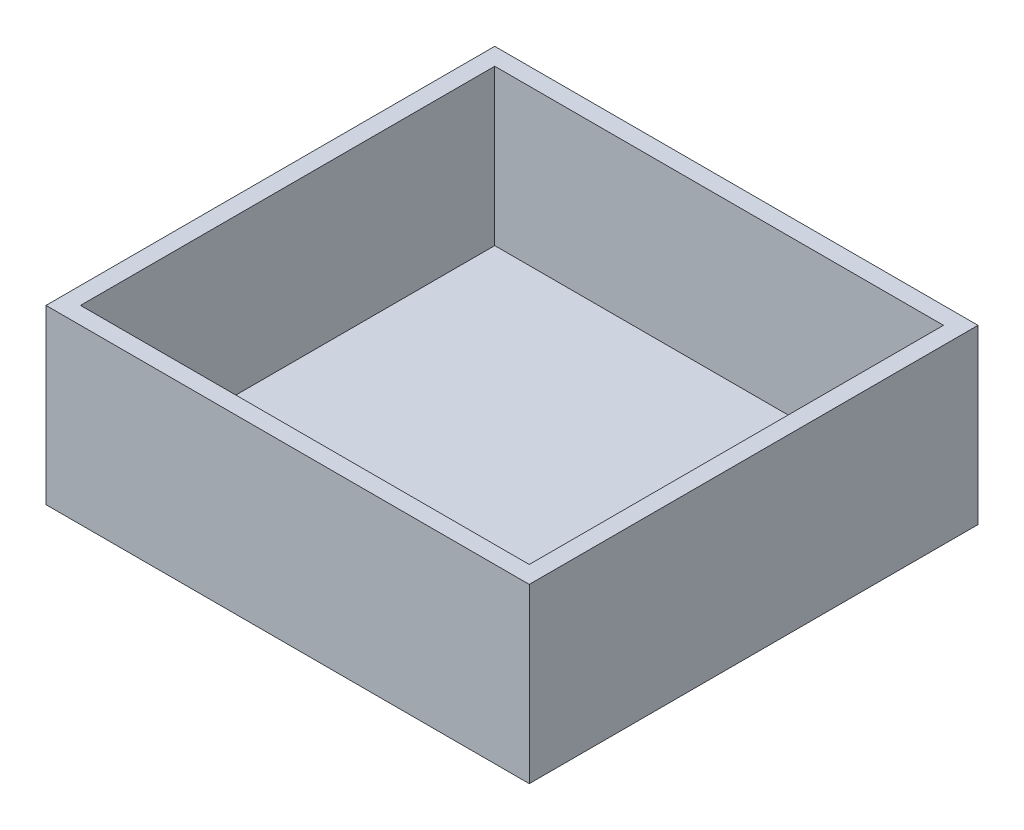
ISO-10303-21;
HEADER;
FILE_DESCRIPTION(('STEP AP214'),'2;1');
FILE_NAME('part.step','',(''),(''),'','','');
FILE_SCHEMA(('AUTOMOTIVE_DESIGN { 1 0 10303 214 1 1 1 1 }'));
ENDSEC;
DATA;
#1=APPLICATION_CONTEXT('core data for automotive mechanical design processes');
#2=APPLICATION_PROTOCOL_DEFINITION('international standard','automotive_design',2000,#1);
#3=PRODUCT_CONTEXT('',#1,'mechanical');
#4=PRODUCT('Part','Part','',(#3));
#5=PRODUCT_RELATED_PRODUCT_CATEGORY('part','',(#4));
#6=PRODUCT_DEFINITION_FORMATION('','',#4);
#7=PRODUCT_DEFINITION_CONTEXT('part definition',#1,'design');
#8=PRODUCT_DEFINITION('design','',#6,#7);
#9=PRODUCT_DEFINITION_SHAPE('','',#8);
#10=(LENGTH_UNIT() NAMED_UNIT(*) SI_UNIT(.MILLI.,.METRE.));
#11=(NAMED_UNIT(*) PLANE_ANGLE_UNIT() SI_UNIT($,.RADIAN.));
#12=(NAMED_UNIT(*) SI_UNIT($,.STERADIAN.) SOLID_ANGLE_UNIT());
#13=UNCERTAINTY_MEASURE_WITH_UNIT(LENGTH_MEASURE(1.E-05),#10,'distance_accuracy_value','');
#14=(GEOMETRIC_REPRESENTATION_CONTEXT(3) GLOBAL_UNCERTAINTY_ASSIGNED_CONTEXT((#13)) GLOBAL_UNIT_ASSIGNED_CONTEXT((#10,
#11,#12)) REPRESENTATION_CONTEXT('',''));
#15=CARTESIAN_POINT('',(0.,0.,0.));
#16=DIRECTION('',(0.,0.,1.));
#17=DIRECTION('',(1.,0.,0.));
#18=AXIS2_PLACEMENT_3D('',#15,#16,#17);
#19=CARTESIAN_POINT('',(70.,25.,-65.));
#20=DIRECTION('',(-1.,0.,0.));
#21=DIRECTION('',(0.,0.,1.));
#22=AXIS2_PLACEMENT_3D('',#19,#20,#21);
#23=PLANE('',#22);
#24=DIRECTION('',(0.,0.,-1.));
#25=VECTOR('',#24,1.);
#26=CARTESIAN_POINT('',(70.,-25.,-65.));
#27=LINE('',#26,#25);
#28=CARTESIAN_POINT('',(70.,-25.,65.));
#29=VERTEX_POINT('',#28);
#30=CARTESIAN_POINT('',(70.,-25.,-65.));
#31=VERTEX_POINT('',#30);
#32=EDGE_CURVE('E142',#29,#31,#27,.T.);
#33=ORIENTED_EDGE('',*,*,#32,.T.);
#34=DIRECTION('',(0.,-1.,0.));
#35=VECTOR('',#34,1.);
#36=CARTESIAN_POINT('',(70.,25.,-65.));
#37=LINE('',#36,#35);
#38=CARTESIAN_POINT('',(70.,25.,-65.));
#39=VERTEX_POINT('',#38);
#40=EDGE_CURVE('E11',#39,#31,#37,.T.);
#41=ORIENTED_EDGE('',*,*,#40,.F.);
#42=DIRECTION('',(0.,0.,-1.));
#43=VECTOR('',#42,1.);
#44=CARTESIAN_POINT('',(70.,25.,-65.));
#45=LINE('',#44,#43);
#46=CARTESIAN_POINT('',(70.,25.,65.));
#47=VERTEX_POINT('',#46);
#48=EDGE_CURVE('E146',#47,#39,#45,.T.);
#49=ORIENTED_EDGE('',*,*,#48,.F.);
#50=DIRECTION('',(0.,-1.,0.));
#51=VECTOR('',#50,1.);
#52=CARTESIAN_POINT('',(70.,25.,65.));
#53=LINE('',#52,#51);
#54=EDGE_CURVE('E152',#47,#29,#53,.T.);
#55=ORIENTED_EDGE('',*,*,#54,.T.);
#56=EDGE_LOOP('',(#33,#41,#49,#55));
#57=FACE_BOUND('',#56,.T.);
#58=ADVANCED_FACE('F34',(#57),#23,.F.);
#59=CARTESIAN_POINT('',(-70.,25.,-65.));
#60=DIRECTION('',(0.,0.,1.));
#61=DIRECTION('',(1.,0.,0.));
#62=AXIS2_PLACEMENT_3D('',#59,#60,#61);
#63=PLANE('',#62);
#64=DIRECTION('',(-1.,0.,0.));
#65=VECTOR('',#64,1.);
#66=CARTESIAN_POINT('',(-70.,-25.,-65.));
#67=LINE('',#66,#65);
#68=CARTESIAN_POINT('',(-70.,-25.,-65.));
#69=VERTEX_POINT('',#68);
#70=EDGE_CURVE('E155',#31,#69,#67,.T.);
#71=ORIENTED_EDGE('',*,*,#70,.T.);
#72=DIRECTION('',(0.,-1.,0.));
#73=VECTOR('',#72,1.);
#74=CARTESIAN_POINT('',(-70.,25.,-65.));
#75=LINE('',#74,#73);
#76=CARTESIAN_POINT('',(-70.,25.,-65.));
#77=VERTEX_POINT('',#76);
#78=EDGE_CURVE('E41',#77,#69,#75,.T.);
#79=ORIENTED_EDGE('',*,*,#78,.F.);
#80=DIRECTION('',(-1.,0.,0.));
#81=VECTOR('',#80,1.);
#82=CARTESIAN_POINT('',(-70.,25.,-65.));
#83=LINE('',#82,#81);
#84=EDGE_CURVE('E85',#39,#77,#83,.T.);
#85=ORIENTED_EDGE('',*,*,#84,.F.);
#86=ORIENTED_EDGE('',*,*,#40,.T.);
#87=EDGE_LOOP('',(#71,#79,#85,#86));
#88=FACE_BOUND('',#87,.T.);
#89=ADVANCED_FACE('F184',(#88),#63,.F.);
#90=CARTESIAN_POINT('',(-70.,25.,-65.));
#91=DIRECTION('',(1.,0.,0.));
#92=DIRECTION('',(0.,0.,-1.));
#93=AXIS2_PLACEMENT_3D('',#90,#91,#92);
#94=PLANE('',#93);
#95=DIRECTION('',(0.,0.,1.));
#96=VECTOR('',#95,1.);
#97=CARTESIAN_POINT('',(-70.,-25.,-65.));
#98=LINE('',#97,#96);
#99=CARTESIAN_POINT('',(-70.,-25.,65.));
#100=VERTEX_POINT('',#99);
#101=EDGE_CURVE('E157',#69,#100,#98,.T.);
#102=ORIENTED_EDGE('',*,*,#101,.T.);
#103=DIRECTION('',(0.,-1.,0.));
#104=VECTOR('',#103,1.);
#105=CARTESIAN_POINT('',(-70.,25.,65.));
#106=LINE('',#105,#104);
#107=CARTESIAN_POINT('',(-70.,25.,65.));
#108=VERTEX_POINT('',#107);
#109=EDGE_CURVE('E161',#108,#100,#106,.T.);
#110=ORIENTED_EDGE('',*,*,#109,.F.);
#111=DIRECTION('',(0.,0.,1.));
#112=VECTOR('',#111,1.);
#113=CARTESIAN_POINT('',(-70.,25.,-65.));
#114=LINE('',#113,#112);
#115=EDGE_CURVE('E149',#77,#108,#114,.T.);
#116=ORIENTED_EDGE('',*,*,#115,.F.);
#117=ORIENTED_EDGE('',*,*,#78,.T.);
#118=EDGE_LOOP('',(#102,#110,#116,#117));
#119=FACE_BOUND('',#118,.T.);
#120=ADVANCED_FACE('F166',(#119),#94,.F.);
#121=CARTESIAN_POINT('',(-70.,25.,65.));
#122=DIRECTION('',(0.,0.,-1.));
#123=DIRECTION('',(-1.,0.,0.));
#124=AXIS2_PLACEMENT_3D('',#121,#122,#123);
#125=PLANE('',#124);
#126=DIRECTION('',(1.,0.,0.));
#127=VECTOR('',#126,1.);
#128=CARTESIAN_POINT('',(-70.,-25.,65.));
#129=LINE('',#128,#127);
#130=EDGE_CURVE('E78',#100,#29,#129,.T.);
#131=ORIENTED_EDGE('',*,*,#130,.T.);
#132=ORIENTED_EDGE('',*,*,#54,.F.);
#133=DIRECTION('',(1.,0.,0.));
#134=VECTOR('',#133,1.);
#135=CARTESIAN_POINT('',(-70.,25.,65.));
#136=LINE('',#135,#134);
#137=EDGE_CURVE('E57',#108,#47,#136,.T.);
#138=ORIENTED_EDGE('',*,*,#137,.F.);
#139=ORIENTED_EDGE('',*,*,#109,.T.);
#140=EDGE_LOOP('',(#131,#132,#138,#139));
#141=FACE_BOUND('',#140,.T.);
#142=ADVANCED_FACE('F174',(#141),#125,.F.);
#143=CARTESIAN_POINT('',(0.,25.,0.));
#144=DIRECTION('',(0.,1.,0.));
#145=DIRECTION('',(0.,0.,1.));
#146=AXIS2_PLACEMENT_3D('',#143,#144,#145);
#147=PLANE('',#146);
#148=DIRECTION('',(0.,0.,-1.));
#149=VECTOR('',#148,1.);
#150=CARTESIAN_POINT('',(65.,25.,-60.));
#151=LINE('',#150,#149);
#152=CARTESIAN_POINT('',(65.,25.,60.));
#153=VERTEX_POINT('',#152);
#154=CARTESIAN_POINT('',(65.,25.,-60.));
#155=VERTEX_POINT('',#154);
#156=EDGE_CURVE('E48',#153,#155,#151,.T.);
#157=ORIENTED_EDGE('',*,*,#156,.F.);
#158=DIRECTION('',(1.,0.,0.));
#159=VECTOR('',#158,1.);
#160=CARTESIAN_POINT('',(-65.,25.,60.));
#161=LINE('',#160,#159);
#162=CARTESIAN_POINT('',(-65.,25.,60.));
#163=VERTEX_POINT('',#162);
#164=EDGE_CURVE('E127',#163,#153,#161,.T.);
#165=ORIENTED_EDGE('',*,*,#164,.F.);
#166=DIRECTION('',(0.,0.,1.));
#167=VECTOR('',#166,1.);
#168=CARTESIAN_POINT('',(-65.,25.,-60.));
#169=LINE('',#168,#167);
#170=CARTESIAN_POINT('',(-65.,25.,-60.));
#171=VERTEX_POINT('',#170);
#172=EDGE_CURVE('E130',#171,#163,#169,.T.);
#173=ORIENTED_EDGE('',*,*,#172,.F.);
#174=DIRECTION('',(-1.,0.,0.));
#175=VECTOR('',#174,1.);
#176=CARTESIAN_POINT('',(-65.,25.,-60.));
#177=LINE('',#176,#175);
#178=EDGE_CURVE('E136',#155,#171,#177,.T.);
#179=ORIENTED_EDGE('',*,*,#178,.F.);
#180=EDGE_LOOP('',(#157,#165,#173,#179));
#181=FACE_BOUND('',#180,.T.);
#182=ORIENTED_EDGE('',*,*,#48,.T.);
#183=ORIENTED_EDGE('',*,*,#84,.T.);
#184=ORIENTED_EDGE('',*,*,#115,.T.);
#185=ORIENTED_EDGE('',*,*,#137,.T.);
#186=EDGE_LOOP('',(#182,#183,#184,#185));
#187=FACE_BOUND('',#186,.T.);
#188=ADVANCED_FACE('F176',(#181,#187),#147,.T.);
#189=CARTESIAN_POINT('',(0.,-25.,0.));
#190=DIRECTION('',(0.,1.,0.));
#191=DIRECTION('',(0.,0.,1.));
#192=AXIS2_PLACEMENT_3D('',#189,#190,#191);
#193=PLANE('',#192);
#194=ORIENTED_EDGE('',*,*,#32,.F.);
#195=ORIENTED_EDGE('',*,*,#130,.F.);
#196=ORIENTED_EDGE('',*,*,#101,.F.);
#197=ORIENTED_EDGE('',*,*,#70,.F.);
#198=EDGE_LOOP('',(#194,#195,#196,#197));
#199=FACE_BOUND('',#198,.T.);
#200=ADVANCED_FACE('F170',(#199),#193,.F.);
#201=CARTESIAN_POINT('',(65.,-20.,-60.));
#202=DIRECTION('',(1.,0.,0.));
#203=DIRECTION('',(0.,0.,-1.));
#204=AXIS2_PLACEMENT_3D('',#201,#202,#203);
#205=PLANE('',#204);
#206=ORIENTED_EDGE('',*,*,#156,.T.);
#207=DIRECTION('',(0.,1.,0.));
#208=VECTOR('',#207,1.);
#209=CARTESIAN_POINT('',(65.,-20.,-60.));
#210=LINE('',#209,#208);
#211=CARTESIAN_POINT('',(65.,-20.,-60.));
#212=VERTEX_POINT('',#211);
#213=EDGE_CURVE('E105',#212,#155,#210,.T.);
#214=ORIENTED_EDGE('',*,*,#213,.F.);
#215=DIRECTION('',(0.,0.,-1.));
#216=VECTOR('',#215,1.);
#217=CARTESIAN_POINT('',(65.,-20.,-60.));
#218=LINE('',#217,#216);
#219=CARTESIAN_POINT('',(65.,-20.,60.));
#220=VERTEX_POINT('',#219);
#221=EDGE_CURVE('E109',#220,#212,#218,.T.);
#222=ORIENTED_EDGE('',*,*,#221,.F.);
#223=DIRECTION('',(0.,1.,0.));
#224=VECTOR('',#223,1.);
#225=CARTESIAN_POINT('',(65.,-20.,60.));
#226=LINE('',#225,#224);
#227=EDGE_CURVE('E140',#220,#153,#226,.T.);
#228=ORIENTED_EDGE('',*,*,#227,.T.);
#229=EDGE_LOOP('',(#206,#214,#222,#228));
#230=FACE_BOUND('',#229,.T.);
#231=ADVANCED_FACE('F107',(#230),#205,.F.);
#232=CARTESIAN_POINT('',(-65.,-20.,60.));
#233=DIRECTION('',(0.,0.,1.));
#234=DIRECTION('',(1.,0.,0.));
#235=AXIS2_PLACEMENT_3D('',#232,#233,#234);
#236=PLANE('',#235);
#237=ORIENTED_EDGE('',*,*,#164,.T.);
#238=ORIENTED_EDGE('',*,*,#227,.F.);
#239=DIRECTION('',(1.,0.,0.));
#240=VECTOR('',#239,1.);
#241=CARTESIAN_POINT('',(-65.,-20.,60.));
#242=LINE('',#241,#240);
#243=CARTESIAN_POINT('',(-65.,-20.,60.));
#244=VERTEX_POINT('',#243);
#245=EDGE_CURVE('E115',#244,#220,#242,.T.);
#246=ORIENTED_EDGE('',*,*,#245,.F.);
#247=DIRECTION('',(0.,1.,0.));
#248=VECTOR('',#247,1.);
#249=CARTESIAN_POINT('',(-65.,-20.,60.));
#250=LINE('',#249,#248);
#251=EDGE_CURVE('E143',#244,#163,#250,.T.);
#252=ORIENTED_EDGE('',*,*,#251,.T.);
#253=EDGE_LOOP('',(#237,#238,#246,#252));
#254=FACE_BOUND('',#253,.T.);
#255=ADVANCED_FACE('F223',(#254),#236,.F.);
#256=CARTESIAN_POINT('',(-65.,-20.,-60.));
#257=DIRECTION('',(-1.,0.,0.));
#258=DIRECTION('',(0.,0.,1.));
#259=AXIS2_PLACEMENT_3D('',#256,#257,#258);
#260=PLANE('',#259);
#261=ORIENTED_EDGE('',*,*,#172,.T.);
#262=ORIENTED_EDGE('',*,*,#251,.F.);
#263=DIRECTION('',(0.,0.,1.));
#264=VECTOR('',#263,1.);
#265=CARTESIAN_POINT('',(-65.,-20.,-60.));
#266=LINE('',#265,#264);
#267=CARTESIAN_POINT('',(-65.,-20.,-60.));
#268=VERTEX_POINT('',#267);
#269=EDGE_CURVE('E123',#268,#244,#266,.T.);
#270=ORIENTED_EDGE('',*,*,#269,.F.);
#271=DIRECTION('',(0.,1.,0.));
#272=VECTOR('',#271,1.);
#273=CARTESIAN_POINT('',(-65.,-20.,-60.));
#274=LINE('',#273,#272);
#275=EDGE_CURVE('E114',#268,#171,#274,.T.);
#276=ORIENTED_EDGE('',*,*,#275,.T.);
#277=EDGE_LOOP('',(#261,#262,#270,#276));
#278=FACE_BOUND('',#277,.T.);
#279=ADVANCED_FACE('F232',(#278),#260,.F.);
#280=CARTESIAN_POINT('',(-65.,-20.,-60.));
#281=DIRECTION('',(0.,0.,-1.));
#282=DIRECTION('',(-1.,0.,0.));
#283=AXIS2_PLACEMENT_3D('',#280,#281,#282);
#284=PLANE('',#283);
#285=ORIENTED_EDGE('',*,*,#178,.T.);
#286=ORIENTED_EDGE('',*,*,#275,.F.);
#287=DIRECTION('',(-1.,0.,0.));
#288=VECTOR('',#287,1.);
#289=CARTESIAN_POINT('',(-65.,-20.,-60.));
#290=LINE('',#289,#288);
#291=EDGE_CURVE('E118',#212,#268,#290,.T.);
#292=ORIENTED_EDGE('',*,*,#291,.F.);
#293=ORIENTED_EDGE('',*,*,#213,.T.);
#294=EDGE_LOOP('',(#285,#286,#292,#293));
#295=FACE_BOUND('',#294,.T.);
#296=ADVANCED_FACE('F119',(#295),#284,.F.);
#297=CARTESIAN_POINT('',(0.,-20.,0.));
#298=DIRECTION('',(0.,1.,0.));
#299=DIRECTION('',(0.,0.,1.));
#300=AXIS2_PLACEMENT_3D('',#297,#298,#299);
#301=PLANE('',#300);
#302=ORIENTED_EDGE('',*,*,#221,.T.);
#303=ORIENTED_EDGE('',*,*,#291,.T.);
#304=ORIENTED_EDGE('',*,*,#269,.T.);
#305=ORIENTED_EDGE('',*,*,#245,.T.);
#306=EDGE_LOOP('',(#302,#303,#304,#305));
#307=FACE_BOUND('',#306,.T.);
#308=ADVANCED_FACE('F125',(#307),#301,.T.);
#309=CLOSED_SHELL('',(#58,#89,#120,#142,#188,#200,#231,#255,#279,#296,#308));
#310=MANIFOLD_SOLID_BREP('B2',#309);
#311=ADVANCED_BREP_SHAPE_REPRESENTATION('',(#18,#310),#14);
#312=SHAPE_DEFINITION_REPRESENTATION(#9,#311);
ENDSEC;
END-ISO-10303-21;
